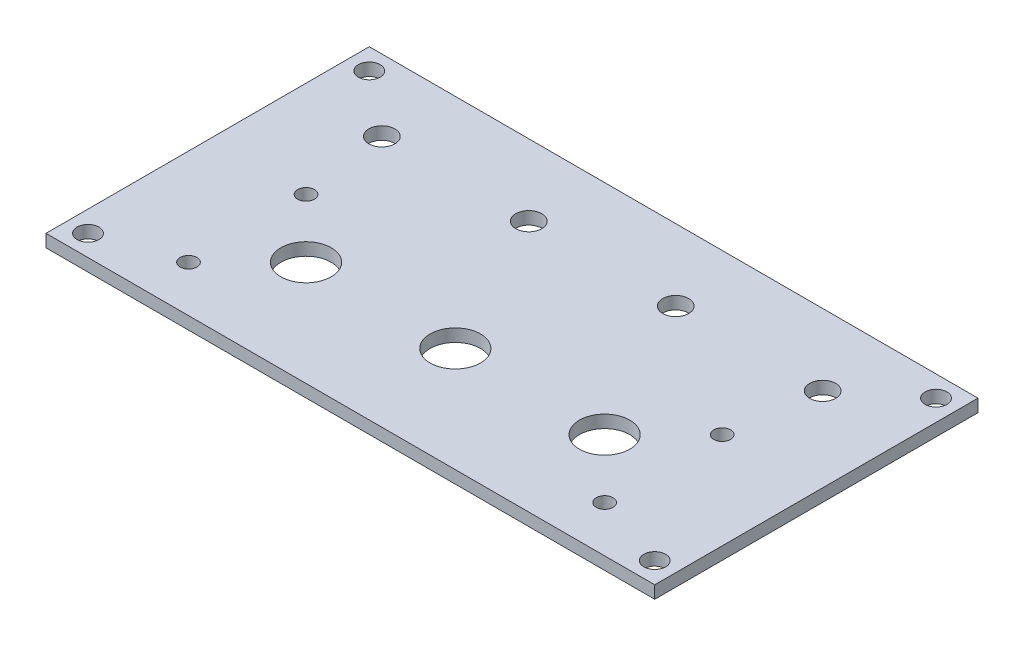
ISO-10303-21;
HEADER;
FILE_DESCRIPTION(('STEP AP214'),'2;1');
FILE_NAME('part.step','',(''),(''),'','','');
FILE_SCHEMA(('AUTOMOTIVE_DESIGN { 1 0 10303 214 1 1 1 1 }'));
ENDSEC;
DATA;
#1=APPLICATION_CONTEXT('core data for automotive mechanical design processes');
#2=APPLICATION_PROTOCOL_DEFINITION('international standard','automotive_design',2000,#1);
#3=PRODUCT_CONTEXT('',#1,'mechanical');
#4=PRODUCT('Part','Part','',(#3));
#5=PRODUCT_RELATED_PRODUCT_CATEGORY('part','',(#4));
#6=PRODUCT_DEFINITION_FORMATION('','',#4);
#7=PRODUCT_DEFINITION_CONTEXT('part definition',#1,'design');
#8=PRODUCT_DEFINITION('design','',#6,#7);
#9=PRODUCT_DEFINITION_SHAPE('','',#8);
#10=(LENGTH_UNIT() NAMED_UNIT(*) SI_UNIT(.MILLI.,.METRE.));
#11=(NAMED_UNIT(*) PLANE_ANGLE_UNIT() SI_UNIT($,.RADIAN.));
#12=(NAMED_UNIT(*) SI_UNIT($,.STERADIAN.) SOLID_ANGLE_UNIT());
#13=UNCERTAINTY_MEASURE_WITH_UNIT(LENGTH_MEASURE(1.E-05),#10,'distance_accuracy_value','');
#14=(GEOMETRIC_REPRESENTATION_CONTEXT(3) GLOBAL_UNCERTAINTY_ASSIGNED_CONTEXT((#13)) GLOBAL_UNIT_ASSIGNED_CONTEXT((#10,
#11,#12)) REPRESENTATION_CONTEXT('',''));
#15=CARTESIAN_POINT('',(0.,0.,0.));
#16=DIRECTION('',(0.,0.,1.));
#17=DIRECTION('',(1.,0.,0.));
#18=AXIS2_PLACEMENT_3D('',#15,#16,#17);
#19=CARTESIAN_POINT('',(0.,3.,0.));
#20=DIRECTION('',(0.,0.,-1.));
#21=DIRECTION('',(-1.,0.,0.));
#22=AXIS2_PLACEMENT_3D('',#19,#20,#21);
#23=PLANE('',#22);
#24=DIRECTION('',(1.,0.,0.));
#25=VECTOR('',#24,1.);
#26=CARTESIAN_POINT('',(0.,0.,0.));
#27=LINE('',#26,#25);
#28=CARTESIAN_POINT('',(0.,0.,0.));
#29=VERTEX_POINT('',#28);
#30=CARTESIAN_POINT('',(145.,0.,0.));
#31=VERTEX_POINT('',#30);
#32=EDGE_CURVE('E145',#29,#31,#27,.T.);
#33=ORIENTED_EDGE('',*,*,#32,.T.);
#34=DIRECTION('',(0.,-1.,0.));
#35=VECTOR('',#34,1.);
#36=CARTESIAN_POINT('',(145.,3.,0.));
#37=LINE('',#36,#35);
#38=CARTESIAN_POINT('',(145.,3.,0.));
#39=VERTEX_POINT('',#38);
#40=EDGE_CURVE('E11',#39,#31,#37,.T.);
#41=ORIENTED_EDGE('',*,*,#40,.F.);
#42=DIRECTION('',(1.,0.,0.));
#43=VECTOR('',#42,1.);
#44=CARTESIAN_POINT('',(0.,3.,0.));
#45=LINE('',#44,#43);
#46=CARTESIAN_POINT('',(0.,3.,0.));
#47=VERTEX_POINT('',#46);
#48=EDGE_CURVE('E86',#47,#39,#45,.T.);
#49=ORIENTED_EDGE('',*,*,#48,.F.);
#50=DIRECTION('',(0.,-1.,0.));
#51=VECTOR('',#50,1.);
#52=CARTESIAN_POINT('',(0.,3.,0.));
#53=LINE('',#52,#51);
#54=EDGE_CURVE('E52',#47,#29,#53,.T.);
#55=ORIENTED_EDGE('',*,*,#54,.T.);
#56=EDGE_LOOP('',(#33,#41,#49,#55));
#57=FACE_BOUND('',#56,.T.);
#58=ADVANCED_FACE('F35',(#57),#23,.F.);
#59=CARTESIAN_POINT('',(145.,3.,0.));
#60=DIRECTION('',(-1.,0.,0.));
#61=DIRECTION('',(0.,0.,1.));
#62=AXIS2_PLACEMENT_3D('',#59,#60,#61);
#63=PLANE('',#62);
#64=DIRECTION('',(0.,0.,-1.));
#65=VECTOR('',#64,1.);
#66=CARTESIAN_POINT('',(145.,0.,0.));
#67=LINE('',#66,#65);
#68=CARTESIAN_POINT('',(145.,0.,-77.));
#69=VERTEX_POINT('',#68);
#70=EDGE_CURVE('E91',#31,#69,#67,.T.);
#71=ORIENTED_EDGE('',*,*,#70,.T.);
#72=DIRECTION('',(0.,-1.,0.));
#73=VECTOR('',#72,1.);
#74=CARTESIAN_POINT('',(145.,3.,-77.));
#75=LINE('',#74,#73);
#76=CARTESIAN_POINT('',(145.,3.,-77.));
#77=VERTEX_POINT('',#76);
#78=EDGE_CURVE('E44',#77,#69,#75,.T.);
#79=ORIENTED_EDGE('',*,*,#78,.F.);
#80=DIRECTION('',(0.,0.,-1.));
#81=VECTOR('',#80,1.);
#82=CARTESIAN_POINT('',(145.,3.,0.));
#83=LINE('',#82,#81);
#84=EDGE_CURVE('E77',#39,#77,#83,.T.);
#85=ORIENTED_EDGE('',*,*,#84,.F.);
#86=ORIENTED_EDGE('',*,*,#40,.T.);
#87=EDGE_LOOP('',(#71,#79,#85,#86));
#88=FACE_BOUND('',#87,.T.);
#89=ADVANCED_FACE('F90',(#88),#63,.F.);
#90=CARTESIAN_POINT('',(0.,3.,-77.));
#91=DIRECTION('',(0.,0.,-1.));
#92=DIRECTION('',(-1.,0.,0.));
#93=AXIS2_PLACEMENT_3D('',#90,#91,#92);
#94=PLANE('',#93);
#95=DIRECTION('',(1.,0.,0.));
#96=VECTOR('',#95,1.);
#97=CARTESIAN_POINT('',(0.,0.,-77.));
#98=LINE('',#97,#96);
#99=CARTESIAN_POINT('',(0.,0.,-77.));
#100=VERTEX_POINT('',#99);
#101=EDGE_CURVE('E148',#100,#69,#98,.T.);
#102=ORIENTED_EDGE('',*,*,#101,.F.);
#103=DIRECTION('',(0.,-1.,0.));
#104=VECTOR('',#103,1.);
#105=CARTESIAN_POINT('',(0.,3.,-77.));
#106=LINE('',#105,#104);
#107=CARTESIAN_POINT('',(0.,3.,-77.));
#108=VERTEX_POINT('',#107);
#109=EDGE_CURVE('E66',#108,#100,#106,.T.);
#110=ORIENTED_EDGE('',*,*,#109,.F.);
#111=DIRECTION('',(1.,0.,0.));
#112=VECTOR('',#111,1.);
#113=CARTESIAN_POINT('',(0.,3.,-77.));
#114=LINE('',#113,#112);
#115=EDGE_CURVE('E85',#108,#77,#114,.T.);
#116=ORIENTED_EDGE('',*,*,#115,.T.);
#117=ORIENTED_EDGE('',*,*,#78,.T.);
#118=EDGE_LOOP('',(#102,#110,#116,#117));
#119=FACE_BOUND('',#118,.T.);
#120=ADVANCED_FACE('F94',(#119),#94,.T.);
#121=CARTESIAN_POINT('',(90.,3.,-60.));
#122=DIRECTION('',(0.,-1.,0.));
#123=DIRECTION('',(0.,0.,-1.));
#124=AXIS2_PLACEMENT_3D('',#121,#122,#123);
#125=CYLINDRICAL_SURFACE('',#124,3.1);
#126=CARTESIAN_POINT('',(90.,3.,-60.));
#127=DIRECTION('',(0.,1.,0.));
#128=DIRECTION('',(0.,0.,1.));
#129=AXIS2_PLACEMENT_3D('',#126,#127,#128);
#130=CIRCLE('',#129,3.1);
#131=CARTESIAN_POINT('',(90.,3.,-56.9));
#132=VERTEX_POINT('',#131);
#133=EDGE_CURVE('E106',#132,#132,#130,.T.);
#134=ORIENTED_EDGE('',*,*,#133,.T.);
#135=EDGE_LOOP('',(#134));
#136=FACE_BOUND('',#135,.T.);
#137=CARTESIAN_POINT('',(90.,0.,-60.));
#138=DIRECTION('',(0.,1.,0.));
#139=DIRECTION('',(0.,0.,1.));
#140=AXIS2_PLACEMENT_3D('',#137,#138,#139);
#141=CIRCLE('',#140,3.1);
#142=CARTESIAN_POINT('',(90.,0.,-56.9));
#143=VERTEX_POINT('',#142);
#144=EDGE_CURVE('E159',#143,#143,#141,.T.);
#145=ORIENTED_EDGE('',*,*,#144,.F.);
#146=EDGE_LOOP('',(#145));
#147=FACE_BOUND('',#146,.T.);
#148=ADVANCED_FACE('F300',(#136,#147),#125,.F.);
#149=CARTESIAN_POINT('',(55.,3.,-60.));
#150=DIRECTION('',(0.,-1.,0.));
#151=DIRECTION('',(0.,0.,-1.));
#152=AXIS2_PLACEMENT_3D('',#149,#150,#151);
#153=CYLINDRICAL_SURFACE('',#152,3.1);
#154=CARTESIAN_POINT('',(55.,3.,-60.));
#155=DIRECTION('',(0.,1.,0.));
#156=DIRECTION('',(0.,0.,1.));
#157=AXIS2_PLACEMENT_3D('',#154,#155,#156);
#158=CIRCLE('',#157,3.1);
#159=CARTESIAN_POINT('',(55.,3.,-56.9));
#160=VERTEX_POINT('',#159);
#161=EDGE_CURVE('E103',#160,#160,#158,.T.);
#162=ORIENTED_EDGE('',*,*,#161,.T.);
#163=EDGE_LOOP('',(#162));
#164=FACE_BOUND('',#163,.T.);
#165=CARTESIAN_POINT('',(55.,0.,-60.));
#166=DIRECTION('',(0.,1.,0.));
#167=DIRECTION('',(0.,0.,1.));
#168=AXIS2_PLACEMENT_3D('',#165,#166,#167);
#169=CIRCLE('',#168,3.1);
#170=CARTESIAN_POINT('',(55.,0.,-56.9));
#171=VERTEX_POINT('',#170);
#172=EDGE_CURVE('E156',#171,#171,#169,.T.);
#173=ORIENTED_EDGE('',*,*,#172,.F.);
#174=EDGE_LOOP('',(#173));
#175=FACE_BOUND('',#174,.T.);
#176=ADVANCED_FACE('F302',(#164,#175),#153,.F.);
#177=CARTESIAN_POINT('',(20.,3.,-60.));
#178=DIRECTION('',(0.,-1.,0.));
#179=DIRECTION('',(0.,0.,-1.));
#180=AXIS2_PLACEMENT_3D('',#177,#178,#179);
#181=CYLINDRICAL_SURFACE('',#180,3.1);
#182=CARTESIAN_POINT('',(20.,3.,-60.));
#183=DIRECTION('',(0.,1.,0.));
#184=DIRECTION('',(0.,0.,1.));
#185=AXIS2_PLACEMENT_3D('',#182,#183,#184);
#186=CIRCLE('',#185,3.1);
#187=CARTESIAN_POINT('',(20.,3.,-56.9));
#188=VERTEX_POINT('',#187);
#189=EDGE_CURVE('E97',#188,#188,#186,.T.);
#190=ORIENTED_EDGE('',*,*,#189,.T.);
#191=EDGE_LOOP('',(#190));
#192=FACE_BOUND('',#191,.T.);
#193=CARTESIAN_POINT('',(20.,0.,-60.));
#194=DIRECTION('',(0.,1.,0.));
#195=DIRECTION('',(0.,0.,1.));
#196=AXIS2_PLACEMENT_3D('',#193,#194,#195);
#197=CIRCLE('',#196,3.1);
#198=CARTESIAN_POINT('',(20.,0.,-56.9));
#199=VERTEX_POINT('',#198);
#200=EDGE_CURVE('E153',#199,#199,#197,.T.);
#201=ORIENTED_EDGE('',*,*,#200,.F.);
#202=EDGE_LOOP('',(#201));
#203=FACE_BOUND('',#202,.T.);
#204=ADVANCED_FACE('F309',(#192,#203),#181,.F.);
#205=CARTESIAN_POINT('',(0.,3.,0.));
#206=DIRECTION('',(-1.,0.,0.));
#207=DIRECTION('',(0.,0.,1.));
#208=AXIS2_PLACEMENT_3D('',#205,#206,#207);
#209=PLANE('',#208);
#210=DIRECTION('',(0.,0.,-1.));
#211=VECTOR('',#210,1.);
#212=CARTESIAN_POINT('',(0.,0.,0.));
#213=LINE('',#212,#211);
#214=EDGE_CURVE('E150',#29,#100,#213,.T.);
#215=ORIENTED_EDGE('',*,*,#214,.F.);
#216=ORIENTED_EDGE('',*,*,#54,.F.);
#217=DIRECTION('',(0.,0.,-1.));
#218=VECTOR('',#217,1.);
#219=CARTESIAN_POINT('',(0.,3.,0.));
#220=LINE('',#219,#218);
#221=EDGE_CURVE('E95',#47,#108,#220,.T.);
#222=ORIENTED_EDGE('',*,*,#221,.T.);
#223=ORIENTED_EDGE('',*,*,#109,.T.);
#224=EDGE_LOOP('',(#215,#216,#222,#223));
#225=FACE_BOUND('',#224,.T.);
#226=ADVANCED_FACE('F233',(#225),#209,.T.);
#227=CARTESIAN_POINT('',(5.,3.,-72.));
#228=DIRECTION('',(0.,-1.,0.));
#229=DIRECTION('',(0.,0.,-1.));
#230=AXIS2_PLACEMENT_3D('',#227,#228,#229);
#231=CYLINDRICAL_SURFACE('',#230,2.6);
#232=CARTESIAN_POINT('',(5.,3.,-72.));
#233=DIRECTION('',(0.,1.,0.));
#234=DIRECTION('',(0.,0.,1.));
#235=AXIS2_PLACEMENT_3D('',#232,#233,#234);
#236=CIRCLE('',#235,2.6);
#237=CARTESIAN_POINT('',(5.,3.,-69.4));
#238=VERTEX_POINT('',#237);
#239=EDGE_CURVE('E201',#238,#238,#236,.T.);
#240=ORIENTED_EDGE('',*,*,#239,.T.);
#241=EDGE_LOOP('',(#240));
#242=FACE_BOUND('',#241,.T.);
#243=CARTESIAN_POINT('',(5.,0.,-72.));
#244=DIRECTION('',(0.,1.,0.));
#245=DIRECTION('',(0.,0.,1.));
#246=AXIS2_PLACEMENT_3D('',#243,#244,#245);
#247=CIRCLE('',#246,2.6);
#248=CARTESIAN_POINT('',(5.,0.,-69.4));
#249=VERTEX_POINT('',#248);
#250=EDGE_CURVE('E142',#249,#249,#247,.T.);
#251=ORIENTED_EDGE('',*,*,#250,.F.);
#252=EDGE_LOOP('',(#251));
#253=FACE_BOUND('',#252,.T.);
#254=ADVANCED_FACE('F205',(#242,#253),#231,.F.);
#255=CARTESIAN_POINT('',(5.,3.,-5.));
#256=DIRECTION('',(0.,-1.,0.));
#257=DIRECTION('',(0.,0.,-1.));
#258=AXIS2_PLACEMENT_3D('',#255,#256,#257);
#259=CYLINDRICAL_SURFACE('',#258,2.6);
#260=CARTESIAN_POINT('',(5.,3.,-5.));
#261=DIRECTION('',(0.,1.,0.));
#262=DIRECTION('',(0.,0.,1.));
#263=AXIS2_PLACEMENT_3D('',#260,#261,#262);
#264=CIRCLE('',#263,2.6);
#265=CARTESIAN_POINT('',(5.,3.,-2.4));
#266=VERTEX_POINT('',#265);
#267=EDGE_CURVE('E198',#266,#266,#264,.T.);
#268=ORIENTED_EDGE('',*,*,#267,.T.);
#269=EDGE_LOOP('',(#268));
#270=FACE_BOUND('',#269,.T.);
#271=CARTESIAN_POINT('',(5.,0.,-5.));
#272=DIRECTION('',(0.,1.,0.));
#273=DIRECTION('',(0.,0.,1.));
#274=AXIS2_PLACEMENT_3D('',#271,#272,#273);
#275=CIRCLE('',#274,2.6);
#276=CARTESIAN_POINT('',(5.,0.,-2.4));
#277=VERTEX_POINT('',#276);
#278=EDGE_CURVE('E139',#277,#277,#275,.T.);
#279=ORIENTED_EDGE('',*,*,#278,.F.);
#280=EDGE_LOOP('',(#279));
#281=FACE_BOUND('',#280,.T.);
#282=ADVANCED_FACE('F232',(#270,#281),#259,.F.);
#283=CARTESIAN_POINT('',(140.,3.,-5.));
#284=DIRECTION('',(0.,-1.,0.));
#285=DIRECTION('',(0.,0.,-1.));
#286=AXIS2_PLACEMENT_3D('',#283,#284,#285);
#287=CYLINDRICAL_SURFACE('',#286,2.59999999999999);
#288=CARTESIAN_POINT('',(140.,3.,-5.));
#289=DIRECTION('',(0.,1.,0.));
#290=DIRECTION('',(0.,0.,1.));
#291=AXIS2_PLACEMENT_3D('',#288,#289,#290);
#292=CIRCLE('',#291,2.59999999999999);
#293=CARTESIAN_POINT('',(140.,3.,-2.40000000000001));
#294=VERTEX_POINT('',#293);
#295=EDGE_CURVE('E195',#294,#294,#292,.T.);
#296=ORIENTED_EDGE('',*,*,#295,.T.);
#297=EDGE_LOOP('',(#296));
#298=FACE_BOUND('',#297,.T.);
#299=CARTESIAN_POINT('',(140.,0.,-5.));
#300=DIRECTION('',(0.,1.,0.));
#301=DIRECTION('',(0.,0.,1.));
#302=AXIS2_PLACEMENT_3D('',#299,#300,#301);
#303=CIRCLE('',#302,2.59999999999999);
#304=CARTESIAN_POINT('',(140.,0.,-2.40000000000001));
#305=VERTEX_POINT('',#304);
#306=EDGE_CURVE('E136',#305,#305,#303,.T.);
#307=ORIENTED_EDGE('',*,*,#306,.F.);
#308=EDGE_LOOP('',(#307));
#309=FACE_BOUND('',#308,.T.);
#310=ADVANCED_FACE('F236',(#298,#309),#287,.F.);
#311=CARTESIAN_POINT('',(140.,3.,-72.));
#312=DIRECTION('',(0.,-1.,0.));
#313=DIRECTION('',(0.,0.,-1.));
#314=AXIS2_PLACEMENT_3D('',#311,#312,#313);
#315=CYLINDRICAL_SURFACE('',#314,2.59999999999999);
#316=CARTESIAN_POINT('',(140.,3.,-72.));
#317=DIRECTION('',(0.,1.,0.));
#318=DIRECTION('',(0.,0.,1.));
#319=AXIS2_PLACEMENT_3D('',#316,#317,#318);
#320=CIRCLE('',#319,2.59999999999999);
#321=CARTESIAN_POINT('',(140.,3.,-69.4));
#322=VERTEX_POINT('',#321);
#323=EDGE_CURVE('E192',#322,#322,#320,.T.);
#324=ORIENTED_EDGE('',*,*,#323,.T.);
#325=EDGE_LOOP('',(#324));
#326=FACE_BOUND('',#325,.T.);
#327=CARTESIAN_POINT('',(140.,0.,-72.));
#328=DIRECTION('',(0.,1.,0.));
#329=DIRECTION('',(0.,0.,1.));
#330=AXIS2_PLACEMENT_3D('',#327,#328,#329);
#331=CIRCLE('',#330,2.59999999999999);
#332=CARTESIAN_POINT('',(140.,0.,-69.4));
#333=VERTEX_POINT('',#332);
#334=EDGE_CURVE('E133',#333,#333,#331,.T.);
#335=ORIENTED_EDGE('',*,*,#334,.F.);
#336=EDGE_LOOP('',(#335));
#337=FACE_BOUND('',#336,.T.);
#338=ADVANCED_FACE('F240',(#326,#337),#315,.F.);
#339=CARTESIAN_POINT('',(36.94,3.,-25.));
#340=DIRECTION('',(0.,-1.,0.));
#341=DIRECTION('',(0.,0.,-1.));
#342=AXIS2_PLACEMENT_3D('',#339,#340,#341);
#343=CYLINDRICAL_SURFACE('',#342,6.);
#344=CARTESIAN_POINT('',(36.94,3.,-25.));
#345=DIRECTION('',(0.,1.,0.));
#346=DIRECTION('',(0.,0.,1.));
#347=AXIS2_PLACEMENT_3D('',#344,#345,#346);
#348=CIRCLE('',#347,6.);
#349=CARTESIAN_POINT('',(36.94,3.,-19.));
#350=VERTEX_POINT('',#349);
#351=EDGE_CURVE('E189',#350,#350,#348,.T.);
#352=ORIENTED_EDGE('',*,*,#351,.T.);
#353=EDGE_LOOP('',(#352));
#354=FACE_BOUND('',#353,.T.);
#355=CARTESIAN_POINT('',(36.94,0.,-25.));
#356=DIRECTION('',(0.,1.,0.));
#357=DIRECTION('',(0.,0.,1.));
#358=AXIS2_PLACEMENT_3D('',#355,#356,#357);
#359=CIRCLE('',#358,6.);
#360=CARTESIAN_POINT('',(36.94,0.,-19.));
#361=VERTEX_POINT('',#360);
#362=EDGE_CURVE('E130',#361,#361,#359,.T.);
#363=ORIENTED_EDGE('',*,*,#362,.F.);
#364=EDGE_LOOP('',(#363));
#365=FACE_BOUND('',#364,.T.);
#366=ADVANCED_FACE('F244',(#354,#365),#343,.F.);
#367=CARTESIAN_POINT('',(72.5,3.,-25.));
#368=DIRECTION('',(0.,-1.,0.));
#369=DIRECTION('',(0.,0.,-1.));
#370=AXIS2_PLACEMENT_3D('',#367,#368,#369);
#371=CYLINDRICAL_SURFACE('',#370,6.);
#372=CARTESIAN_POINT('',(72.5,3.,-25.));
#373=DIRECTION('',(0.,1.,0.));
#374=DIRECTION('',(0.,0.,1.));
#375=AXIS2_PLACEMENT_3D('',#372,#373,#374);
#376=CIRCLE('',#375,6.);
#377=CARTESIAN_POINT('',(72.5,3.,-19.));
#378=VERTEX_POINT('',#377);
#379=EDGE_CURVE('E186',#378,#378,#376,.T.);
#380=ORIENTED_EDGE('',*,*,#379,.T.);
#381=EDGE_LOOP('',(#380));
#382=FACE_BOUND('',#381,.T.);
#383=CARTESIAN_POINT('',(72.5,0.,-25.));
#384=DIRECTION('',(0.,1.,0.));
#385=DIRECTION('',(0.,0.,1.));
#386=AXIS2_PLACEMENT_3D('',#383,#384,#385);
#387=CIRCLE('',#386,6.);
#388=CARTESIAN_POINT('',(72.5,0.,-19.));
#389=VERTEX_POINT('',#388);
#390=EDGE_CURVE('E127',#389,#389,#387,.T.);
#391=ORIENTED_EDGE('',*,*,#390,.F.);
#392=EDGE_LOOP('',(#391));
#393=FACE_BOUND('',#392,.T.);
#394=ADVANCED_FACE('F248',(#382,#393),#371,.F.);
#395=CARTESIAN_POINT('',(108.06,3.,-25.));
#396=DIRECTION('',(0.,-1.,0.));
#397=DIRECTION('',(0.,0.,-1.));
#398=AXIS2_PLACEMENT_3D('',#395,#396,#397);
#399=CYLINDRICAL_SURFACE('',#398,6.00000000000002);
#400=CARTESIAN_POINT('',(108.06,3.,-25.));
#401=DIRECTION('',(0.,1.,0.));
#402=DIRECTION('',(0.,0.,1.));
#403=AXIS2_PLACEMENT_3D('',#400,#401,#402);
#404=CIRCLE('',#403,6.00000000000002);
#405=CARTESIAN_POINT('',(108.06,3.,-19.));
#406=VERTEX_POINT('',#405);
#407=EDGE_CURVE('E183',#406,#406,#404,.T.);
#408=ORIENTED_EDGE('',*,*,#407,.T.);
#409=EDGE_LOOP('',(#408));
#410=FACE_BOUND('',#409,.T.);
#411=CARTESIAN_POINT('',(108.06,0.,-25.));
#412=DIRECTION('',(0.,1.,0.));
#413=DIRECTION('',(0.,0.,1.));
#414=AXIS2_PLACEMENT_3D('',#411,#412,#413);
#415=CIRCLE('',#414,6.00000000000002);
#416=CARTESIAN_POINT('',(108.06,0.,-19.));
#417=VERTEX_POINT('',#416);
#418=EDGE_CURVE('E124',#417,#417,#415,.T.);
#419=ORIENTED_EDGE('',*,*,#418,.F.);
#420=EDGE_LOOP('',(#419));
#421=FACE_BOUND('',#420,.T.);
#422=ADVANCED_FACE('F252',(#410,#421),#399,.F.);
#423=CARTESIAN_POINT('',(22.94,3.,-39.));
#424=DIRECTION('',(0.,-1.,0.));
#425=DIRECTION('',(0.,0.,-1.));
#426=AXIS2_PLACEMENT_3D('',#423,#424,#425);
#427=CYLINDRICAL_SURFACE('',#426,2.);
#428=CARTESIAN_POINT('',(22.94,3.,-39.));
#429=DIRECTION('',(0.,1.,0.));
#430=DIRECTION('',(0.,0.,1.));
#431=AXIS2_PLACEMENT_3D('',#428,#429,#430);
#432=CIRCLE('',#431,2.);
#433=CARTESIAN_POINT('',(22.94,3.,-37.));
#434=VERTEX_POINT('',#433);
#435=EDGE_CURVE('E180',#434,#434,#432,.T.);
#436=ORIENTED_EDGE('',*,*,#435,.T.);
#437=EDGE_LOOP('',(#436));
#438=FACE_BOUND('',#437,.T.);
#439=CARTESIAN_POINT('',(22.94,0.,-39.));
#440=DIRECTION('',(0.,1.,0.));
#441=DIRECTION('',(0.,0.,1.));
#442=AXIS2_PLACEMENT_3D('',#439,#440,#441);
#443=CIRCLE('',#442,2.);
#444=CARTESIAN_POINT('',(22.94,0.,-37.));
#445=VERTEX_POINT('',#444);
#446=EDGE_CURVE('E121',#445,#445,#443,.T.);
#447=ORIENTED_EDGE('',*,*,#446,.F.);
#448=EDGE_LOOP('',(#447));
#449=FACE_BOUND('',#448,.T.);
#450=ADVANCED_FACE('F256',(#438,#449),#427,.F.);
#451=CARTESIAN_POINT('',(122.06,3.,-39.));
#452=DIRECTION('',(0.,-1.,0.));
#453=DIRECTION('',(0.,0.,-1.));
#454=AXIS2_PLACEMENT_3D('',#451,#452,#453);
#455=CYLINDRICAL_SURFACE('',#454,2.);
#456=CARTESIAN_POINT('',(122.06,3.,-39.));
#457=DIRECTION('',(0.,1.,0.));
#458=DIRECTION('',(0.,0.,1.));
#459=AXIS2_PLACEMENT_3D('',#456,#457,#458);
#460=CIRCLE('',#459,2.);
#461=CARTESIAN_POINT('',(122.06,3.,-37.));
#462=VERTEX_POINT('',#461);
#463=EDGE_CURVE('E175',#462,#462,#460,.T.);
#464=ORIENTED_EDGE('',*,*,#463,.T.);
#465=EDGE_LOOP('',(#464));
#466=FACE_BOUND('',#465,.T.);
#467=CARTESIAN_POINT('',(122.06,0.,-39.));
#468=DIRECTION('',(0.,1.,0.));
#469=DIRECTION('',(0.,0.,1.));
#470=AXIS2_PLACEMENT_3D('',#467,#468,#469);
#471=CIRCLE('',#470,2.);
#472=CARTESIAN_POINT('',(122.06,0.,-37.));
#473=VERTEX_POINT('',#472);
#474=EDGE_CURVE('E118',#473,#473,#471,.T.);
#475=ORIENTED_EDGE('',*,*,#474,.F.);
#476=EDGE_LOOP('',(#475));
#477=FACE_BOUND('',#476,.T.);
#478=ADVANCED_FACE('F260',(#466,#477),#455,.F.);
#479=CARTESIAN_POINT('',(122.06,3.,-11.));
#480=DIRECTION('',(0.,-1.,0.));
#481=DIRECTION('',(0.,0.,-1.));
#482=AXIS2_PLACEMENT_3D('',#479,#480,#481);
#483=CYLINDRICAL_SURFACE('',#482,2.);
#484=CARTESIAN_POINT('',(122.06,3.,-11.));
#485=DIRECTION('',(0.,1.,0.));
#486=DIRECTION('',(0.,0.,1.));
#487=AXIS2_PLACEMENT_3D('',#484,#485,#486);
#488=CIRCLE('',#487,2.);
#489=CARTESIAN_POINT('',(122.06,3.,-9.00000000000001));
#490=VERTEX_POINT('',#489);
#491=EDGE_CURVE('E170',#490,#490,#488,.T.);
#492=ORIENTED_EDGE('',*,*,#491,.T.);
#493=EDGE_LOOP('',(#492));
#494=FACE_BOUND('',#493,.T.);
#495=CARTESIAN_POINT('',(122.06,0.,-11.));
#496=DIRECTION('',(0.,1.,0.));
#497=DIRECTION('',(0.,0.,1.));
#498=AXIS2_PLACEMENT_3D('',#495,#496,#497);
#499=CIRCLE('',#498,2.);
#500=CARTESIAN_POINT('',(122.06,0.,-9.00000000000001));
#501=VERTEX_POINT('',#500);
#502=EDGE_CURVE('E115',#501,#501,#499,.T.);
#503=ORIENTED_EDGE('',*,*,#502,.F.);
#504=EDGE_LOOP('',(#503));
#505=FACE_BOUND('',#504,.T.);
#506=ADVANCED_FACE('F263',(#494,#505),#483,.F.);
#507=CARTESIAN_POINT('',(22.94,3.,-11.));
#508=DIRECTION('',(0.,-1.,0.));
#509=DIRECTION('',(0.,0.,-1.));
#510=AXIS2_PLACEMENT_3D('',#507,#508,#509);
#511=CYLINDRICAL_SURFACE('',#510,2.);
#512=CARTESIAN_POINT('',(22.94,3.,-11.));
#513=DIRECTION('',(0.,1.,0.));
#514=DIRECTION('',(0.,0.,1.));
#515=AXIS2_PLACEMENT_3D('',#512,#513,#514);
#516=CIRCLE('',#515,2.);
#517=CARTESIAN_POINT('',(22.94,3.,-9.00000000000001));
#518=VERTEX_POINT('',#517);
#519=EDGE_CURVE('E165',#518,#518,#516,.T.);
#520=ORIENTED_EDGE('',*,*,#519,.T.);
#521=EDGE_LOOP('',(#520));
#522=FACE_BOUND('',#521,.T.);
#523=CARTESIAN_POINT('',(22.94,0.,-11.));
#524=DIRECTION('',(0.,1.,0.));
#525=DIRECTION('',(0.,0.,1.));
#526=AXIS2_PLACEMENT_3D('',#523,#524,#525);
#527=CIRCLE('',#526,2.);
#528=CARTESIAN_POINT('',(22.94,0.,-9.00000000000001));
#529=VERTEX_POINT('',#528);
#530=EDGE_CURVE('E112',#529,#529,#527,.T.);
#531=ORIENTED_EDGE('',*,*,#530,.F.);
#532=EDGE_LOOP('',(#531));
#533=FACE_BOUND('',#532,.T.);
#534=ADVANCED_FACE('F37',(#522,#533),#511,.F.);
#535=CARTESIAN_POINT('',(125.,3.,-60.));
#536=DIRECTION('',(0.,-1.,0.));
#537=DIRECTION('',(0.,0.,-1.));
#538=AXIS2_PLACEMENT_3D('',#535,#536,#537);
#539=CYLINDRICAL_SURFACE('',#538,3.09999999999996);
#540=CARTESIAN_POINT('',(125.,3.,-60.));
#541=DIRECTION('',(0.,1.,0.));
#542=DIRECTION('',(0.,0.,1.));
#543=AXIS2_PLACEMENT_3D('',#540,#541,#542);
#544=CIRCLE('',#543,3.09999999999996);
#545=CARTESIAN_POINT('',(125.,3.,-56.9));
#546=VERTEX_POINT('',#545);
#547=EDGE_CURVE('E109',#546,#546,#544,.T.);
#548=ORIENTED_EDGE('',*,*,#547,.T.);
#549=EDGE_LOOP('',(#548));
#550=FACE_BOUND('',#549,.T.);
#551=CARTESIAN_POINT('',(125.,0.,-60.));
#552=DIRECTION('',(0.,1.,0.));
#553=DIRECTION('',(0.,0.,1.));
#554=AXIS2_PLACEMENT_3D('',#551,#552,#553);
#555=CIRCLE('',#554,3.09999999999996);
#556=CARTESIAN_POINT('',(125.,0.,-56.9));
#557=VERTEX_POINT('',#556);
#558=EDGE_CURVE('E162',#557,#557,#555,.T.);
#559=ORIENTED_EDGE('',*,*,#558,.F.);
#560=EDGE_LOOP('',(#559));
#561=FACE_BOUND('',#560,.T.);
#562=ADVANCED_FACE('F210',(#550,#561),#539,.F.);
#563=CARTESIAN_POINT('',(0.,3.,0.));
#564=DIRECTION('',(0.,1.,0.));
#565=DIRECTION('',(0.,0.,1.));
#566=AXIS2_PLACEMENT_3D('',#563,#564,#565);
#567=PLANE('',#566);
#568=ORIENTED_EDGE('',*,*,#519,.F.);
#569=EDGE_LOOP('',(#568));
#570=FACE_BOUND('',#569,.T.);
#571=ORIENTED_EDGE('',*,*,#491,.F.);
#572=EDGE_LOOP('',(#571));
#573=FACE_BOUND('',#572,.T.);
#574=ORIENTED_EDGE('',*,*,#463,.F.);
#575=EDGE_LOOP('',(#574));
#576=FACE_BOUND('',#575,.T.);
#577=ORIENTED_EDGE('',*,*,#435,.F.);
#578=EDGE_LOOP('',(#577));
#579=FACE_BOUND('',#578,.T.);
#580=ORIENTED_EDGE('',*,*,#407,.F.);
#581=EDGE_LOOP('',(#580));
#582=FACE_BOUND('',#581,.T.);
#583=ORIENTED_EDGE('',*,*,#379,.F.);
#584=EDGE_LOOP('',(#583));
#585=FACE_BOUND('',#584,.T.);
#586=ORIENTED_EDGE('',*,*,#351,.F.);
#587=EDGE_LOOP('',(#586));
#588=FACE_BOUND('',#587,.T.);
#589=ORIENTED_EDGE('',*,*,#323,.F.);
#590=EDGE_LOOP('',(#589));
#591=FACE_BOUND('',#590,.T.);
#592=ORIENTED_EDGE('',*,*,#295,.F.);
#593=EDGE_LOOP('',(#592));
#594=FACE_BOUND('',#593,.T.);
#595=ORIENTED_EDGE('',*,*,#267,.F.);
#596=EDGE_LOOP('',(#595));
#597=FACE_BOUND('',#596,.T.);
#598=ORIENTED_EDGE('',*,*,#239,.F.);
#599=EDGE_LOOP('',(#598));
#600=FACE_BOUND('',#599,.T.);
#601=ORIENTED_EDGE('',*,*,#48,.T.);
#602=ORIENTED_EDGE('',*,*,#84,.T.);
#603=ORIENTED_EDGE('',*,*,#115,.F.);
#604=ORIENTED_EDGE('',*,*,#221,.F.);
#605=EDGE_LOOP('',(#601,#602,#603,#604));
#606=FACE_BOUND('',#605,.T.);
#607=ORIENTED_EDGE('',*,*,#189,.F.);
#608=EDGE_LOOP('',(#607));
#609=FACE_BOUND('',#608,.T.);
#610=ORIENTED_EDGE('',*,*,#161,.F.);
#611=EDGE_LOOP('',(#610));
#612=FACE_BOUND('',#611,.T.);
#613=ORIENTED_EDGE('',*,*,#133,.F.);
#614=EDGE_LOOP('',(#613));
#615=FACE_BOUND('',#614,.T.);
#616=ORIENTED_EDGE('',*,*,#547,.F.);
#617=EDGE_LOOP('',(#616));
#618=FACE_BOUND('',#617,.T.);
#619=ADVANCED_FACE('F81',(#570,#573,#576,#579,#582,#585,#588,#591,#594,#597,#600,#606,#609,#612,
#615,#618),#567,.T.);
#620=CARTESIAN_POINT('',(0.,0.,0.));
#621=DIRECTION('',(0.,1.,0.));
#622=DIRECTION('',(0.,0.,1.));
#623=AXIS2_PLACEMENT_3D('',#620,#621,#622);
#624=PLANE('',#623);
#625=ORIENTED_EDGE('',*,*,#530,.T.);
#626=EDGE_LOOP('',(#625));
#627=FACE_BOUND('',#626,.T.);
#628=ORIENTED_EDGE('',*,*,#502,.T.);
#629=EDGE_LOOP('',(#628));
#630=FACE_BOUND('',#629,.T.);
#631=ORIENTED_EDGE('',*,*,#474,.T.);
#632=EDGE_LOOP('',(#631));
#633=FACE_BOUND('',#632,.T.);
#634=ORIENTED_EDGE('',*,*,#446,.T.);
#635=EDGE_LOOP('',(#634));
#636=FACE_BOUND('',#635,.T.);
#637=ORIENTED_EDGE('',*,*,#418,.T.);
#638=EDGE_LOOP('',(#637));
#639=FACE_BOUND('',#638,.T.);
#640=ORIENTED_EDGE('',*,*,#390,.T.);
#641=EDGE_LOOP('',(#640));
#642=FACE_BOUND('',#641,.T.);
#643=ORIENTED_EDGE('',*,*,#362,.T.);
#644=EDGE_LOOP('',(#643));
#645=FACE_BOUND('',#644,.T.);
#646=ORIENTED_EDGE('',*,*,#334,.T.);
#647=EDGE_LOOP('',(#646));
#648=FACE_BOUND('',#647,.T.);
#649=ORIENTED_EDGE('',*,*,#306,.T.);
#650=EDGE_LOOP('',(#649));
#651=FACE_BOUND('',#650,.T.);
#652=ORIENTED_EDGE('',*,*,#278,.T.);
#653=EDGE_LOOP('',(#652));
#654=FACE_BOUND('',#653,.T.);
#655=ORIENTED_EDGE('',*,*,#250,.T.);
#656=EDGE_LOOP('',(#655));
#657=FACE_BOUND('',#656,.T.);
#658=ORIENTED_EDGE('',*,*,#32,.F.);
#659=ORIENTED_EDGE('',*,*,#214,.T.);
#660=ORIENTED_EDGE('',*,*,#101,.T.);
#661=ORIENTED_EDGE('',*,*,#70,.F.);
#662=EDGE_LOOP('',(#658,#659,#660,#661));
#663=FACE_BOUND('',#662,.T.);
#664=ORIENTED_EDGE('',*,*,#200,.T.);
#665=EDGE_LOOP('',(#664));
#666=FACE_BOUND('',#665,.T.);
#667=ORIENTED_EDGE('',*,*,#172,.T.);
#668=EDGE_LOOP('',(#667));
#669=FACE_BOUND('',#668,.T.);
#670=ORIENTED_EDGE('',*,*,#144,.T.);
#671=EDGE_LOOP('',(#670));
#672=FACE_BOUND('',#671,.T.);
#673=ORIENTED_EDGE('',*,*,#558,.T.);
#674=EDGE_LOOP('',(#673));
#675=FACE_BOUND('',#674,.T.);
#676=ADVANCED_FACE('F209',(#627,#630,#633,#636,#639,#642,#645,#648,#651,#654,#657,#663,#666,
#669,#672,#675),#624,.F.);
#677=CLOSED_SHELL('',(#58,#89,#120,#148,#176,#204,#226,#254,#282,#310,#338,#366,#394,#422,#450,
#478,#506,#534,#562,#619,#676));
#678=MANIFOLD_SOLID_BREP('B2',#677);
#679=ADVANCED_BREP_SHAPE_REPRESENTATION('',(#18,#678),#14);
#680=SHAPE_DEFINITION_REPRESENTATION(#9,#679);
ENDSEC;
END-ISO-10303-21;
